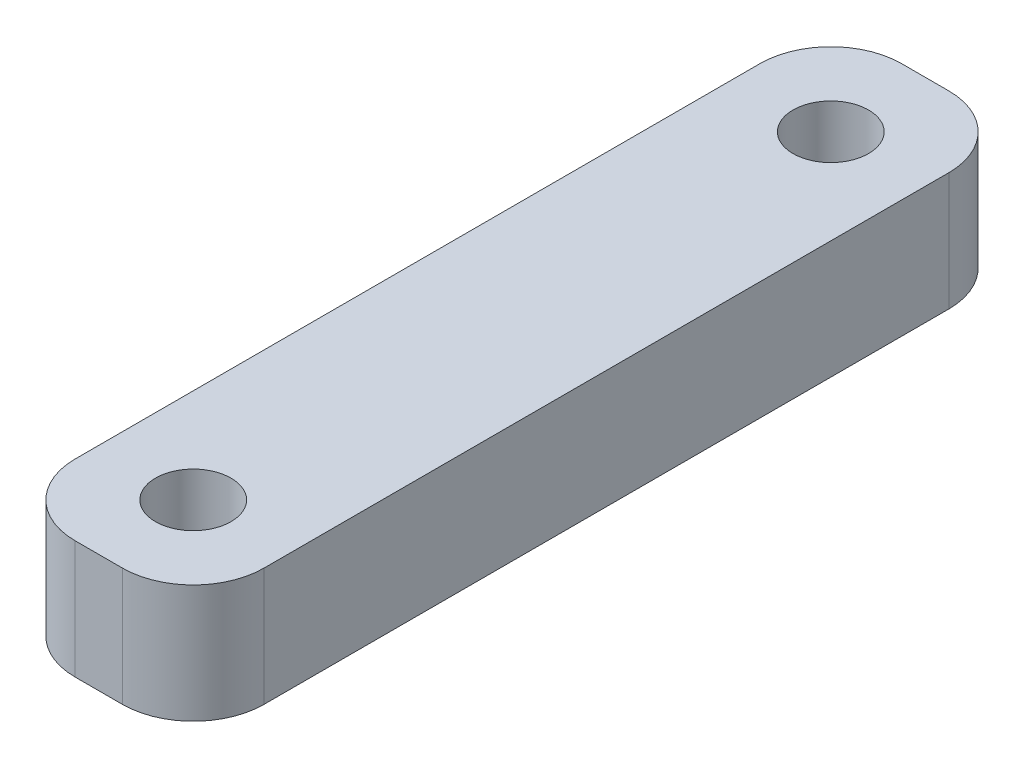
ISO-10303-21;
HEADER;
FILE_DESCRIPTION(('STEP AP214'),'2;1');
FILE_NAME('part.step','',(''),(''),'','','');
FILE_SCHEMA(('AUTOMOTIVE_DESIGN { 1 0 10303 214 1 1 1 1 }'));
ENDSEC;
DATA;
#1=APPLICATION_CONTEXT('core data for automotive mechanical design processes');
#2=APPLICATION_PROTOCOL_DEFINITION('international standard','automotive_design',2000,#1);
#3=PRODUCT_CONTEXT('',#1,'mechanical');
#4=PRODUCT('Part','Part','',(#3));
#5=PRODUCT_RELATED_PRODUCT_CATEGORY('part','',(#4));
#6=PRODUCT_DEFINITION_FORMATION('','',#4);
#7=PRODUCT_DEFINITION_CONTEXT('part definition',#1,'design');
#8=PRODUCT_DEFINITION('design','',#6,#7);
#9=PRODUCT_DEFINITION_SHAPE('','',#8);
#10=(LENGTH_UNIT() NAMED_UNIT(*) SI_UNIT(.MILLI.,.METRE.));
#11=(NAMED_UNIT(*) PLANE_ANGLE_UNIT() SI_UNIT($,.RADIAN.));
#12=(NAMED_UNIT(*) SI_UNIT($,.STERADIAN.) SOLID_ANGLE_UNIT());
#13=UNCERTAINTY_MEASURE_WITH_UNIT(LENGTH_MEASURE(1.E-05),#10,'distance_accuracy_value','');
#14=(GEOMETRIC_REPRESENTATION_CONTEXT(3) GLOBAL_UNCERTAINTY_ASSIGNED_CONTEXT((#13)) GLOBAL_UNIT_ASSIGNED_CONTEXT((#10,
#11,#12)) REPRESENTATION_CONTEXT('',''));
#15=CARTESIAN_POINT('',(0.,0.,0.));
#16=DIRECTION('',(0.,0.,1.));
#17=DIRECTION('',(1.,0.,0.));
#18=AXIS2_PLACEMENT_3D('',#15,#16,#17);
#19=CARTESIAN_POINT('',(0.,0.,35.));
#20=DIRECTION('',(1.,0.,0.));
#21=DIRECTION('',(0.,1.,0.));
#22=AXIS2_PLACEMENT_3D('',#19,#20,#21);
#23=PLANE('',#22);
#24=DIRECTION('',(0.,0.,-1.));
#25=VECTOR('',#24,1.);
#26=CARTESIAN_POINT('',(0.,0.,35.));
#27=LINE('',#26,#25);
#28=CARTESIAN_POINT('',(0.,0.,32.));
#29=VERTEX_POINT('',#28);
#30=CARTESIAN_POINT('',(0.,0.,3.));
#31=VERTEX_POINT('',#30);
#32=EDGE_CURVE('E154',#29,#31,#27,.T.);
#33=ORIENTED_EDGE('',*,*,#32,.T.);
#34=DIRECTION('',(0.,-1.,0.));
#35=VECTOR('',#34,1.);
#36=CARTESIAN_POINT('',(0.,0.,3.));
#37=LINE('',#36,#35);
#38=CARTESIAN_POINT('',(0.,-5.,3.));
#39=VERTEX_POINT('',#38);
#40=EDGE_CURVE('E118',#31,#39,#37,.T.);
#41=ORIENTED_EDGE('',*,*,#40,.T.);
#42=DIRECTION('',(0.,0.,-1.));
#43=VECTOR('',#42,1.);
#44=CARTESIAN_POINT('',(0.,-5.,35.));
#45=LINE('',#44,#43);
#46=CARTESIAN_POINT('',(0.,-5.,32.));
#47=VERTEX_POINT('',#46);
#48=EDGE_CURVE('E103',#47,#39,#45,.T.);
#49=ORIENTED_EDGE('',*,*,#48,.F.);
#50=DIRECTION('',(0.,-1.,0.));
#51=VECTOR('',#50,1.);
#52=CARTESIAN_POINT('',(0.,0.,32.));
#53=LINE('',#52,#51);
#54=EDGE_CURVE('E115',#47,#29,#53,.F.);
#55=ORIENTED_EDGE('',*,*,#54,.T.);
#56=EDGE_LOOP('',(#33,#41,#49,#55));
#57=FACE_BOUND('',#56,.T.);
#58=ADVANCED_FACE('F33',(#57),#23,.F.);
#59=CARTESIAN_POINT('',(0.,-5.,35.));
#60=DIRECTION('',(0.,1.,0.));
#61=DIRECTION('',(0.,0.,1.));
#62=AXIS2_PLACEMENT_3D('',#59,#60,#61);
#63=PLANE('',#62);
#64=CARTESIAN_POINT('',(4.,-5.,31.));
#65=DIRECTION('',(0.,1.,0.));
#66=DIRECTION('',(0.,0.,1.));
#67=AXIS2_PLACEMENT_3D('',#64,#65,#66);
#68=CIRCLE('',#67,1.59999999999997);
#69=CARTESIAN_POINT('',(4.,-5.,32.6));
#70=VERTEX_POINT('',#69);
#71=EDGE_CURVE('E290',#70,#70,#68,.T.);
#72=ORIENTED_EDGE('',*,*,#71,.T.);
#73=EDGE_LOOP('',(#72));
#74=FACE_BOUND('',#73,.T.);
#75=CARTESIAN_POINT('',(4.,-5.,4.));
#76=DIRECTION('',(0.,1.,0.));
#77=DIRECTION('',(0.,0.,1.));
#78=AXIS2_PLACEMENT_3D('',#75,#76,#77);
#79=CIRCLE('',#78,1.6);
#80=CARTESIAN_POINT('',(4.,-5.,5.6));
#81=VERTEX_POINT('',#80);
#82=EDGE_CURVE('E165',#81,#81,#79,.T.);
#83=ORIENTED_EDGE('',*,*,#82,.T.);
#84=EDGE_LOOP('',(#83));
#85=FACE_BOUND('',#84,.T.);
#86=ORIENTED_EDGE('',*,*,#48,.T.);
#87=CARTESIAN_POINT('',(3.,-5.,3.));
#88=DIRECTION('',(0.,1.,0.));
#89=DIRECTION('',(0.,0.,1.));
#90=AXIS2_PLACEMENT_3D('',#87,#88,#89);
#91=CIRCLE('',#90,3.);
#92=CARTESIAN_POINT('',(3.,-5.,0.));
#93=VERTEX_POINT('',#92);
#94=EDGE_CURVE('E130',#39,#93,#91,.F.);
#95=ORIENTED_EDGE('',*,*,#94,.T.);
#96=DIRECTION('',(1.,0.,0.));
#97=VECTOR('',#96,1.);
#98=CARTESIAN_POINT('',(0.,-5.,0.));
#99=LINE('',#98,#97);
#100=CARTESIAN_POINT('',(5.,-5.,0.));
#101=VERTEX_POINT('',#100);
#102=EDGE_CURVE('E162',#93,#101,#99,.T.);
#103=ORIENTED_EDGE('',*,*,#102,.T.);
#104=CARTESIAN_POINT('',(5.,-5.,3.));
#105=DIRECTION('',(0.,1.,0.));
#106=DIRECTION('',(0.,0.,1.));
#107=AXIS2_PLACEMENT_3D('',#104,#105,#106);
#108=CIRCLE('',#107,3.);
#109=CARTESIAN_POINT('',(8.,-5.,3.));
#110=VERTEX_POINT('',#109);
#111=EDGE_CURVE('E109',#101,#110,#108,.F.);
#112=ORIENTED_EDGE('',*,*,#111,.T.);
#113=DIRECTION('',(0.,0.,-1.));
#114=VECTOR('',#113,1.);
#115=CARTESIAN_POINT('',(8.,-5.,35.));
#116=LINE('',#115,#114);
#117=CARTESIAN_POINT('',(8.,-5.,32.));
#118=VERTEX_POINT('',#117);
#119=EDGE_CURVE('E119',#118,#110,#116,.T.);
#120=ORIENTED_EDGE('',*,*,#119,.F.);
#121=CARTESIAN_POINT('',(5.,-5.,32.));
#122=DIRECTION('',(0.,1.,0.));
#123=DIRECTION('',(0.,0.,1.));
#124=AXIS2_PLACEMENT_3D('',#121,#122,#123);
#125=CIRCLE('',#124,3.);
#126=CARTESIAN_POINT('',(5.,-5.,35.));
#127=VERTEX_POINT('',#126);
#128=EDGE_CURVE('E110',#118,#127,#125,.F.);
#129=ORIENTED_EDGE('',*,*,#128,.T.);
#130=DIRECTION('',(1.,0.,0.));
#131=VECTOR('',#130,1.);
#132=CARTESIAN_POINT('',(0.,-5.,35.));
#133=LINE('',#132,#131);
#134=CARTESIAN_POINT('',(3.,-5.,35.));
#135=VERTEX_POINT('',#134);
#136=EDGE_CURVE('E105',#135,#127,#133,.T.);
#137=ORIENTED_EDGE('',*,*,#136,.F.);
#138=CARTESIAN_POINT('',(3.,-5.,32.));
#139=DIRECTION('',(0.,1.,0.));
#140=DIRECTION('',(0.,0.,1.));
#141=AXIS2_PLACEMENT_3D('',#138,#139,#140);
#142=CIRCLE('',#141,3.);
#143=EDGE_CURVE('E100',#135,#47,#142,.F.);
#144=ORIENTED_EDGE('',*,*,#143,.T.);
#145=EDGE_LOOP('',(#86,#95,#103,#112,#120,#129,#137,#144));
#146=FACE_BOUND('',#145,.T.);
#147=ADVANCED_FACE('F102',(#74,#85,#146),#63,.F.);
#148=CARTESIAN_POINT('',(8.,0.,35.));
#149=DIRECTION('',(-1.,0.,0.));
#150=DIRECTION('',(0.,-1.,0.));
#151=AXIS2_PLACEMENT_3D('',#148,#149,#150);
#152=PLANE('',#151);
#153=ORIENTED_EDGE('',*,*,#119,.T.);
#154=DIRECTION('',(0.,1.,0.));
#155=VECTOR('',#154,1.);
#156=CARTESIAN_POINT('',(8.,0.,3.));
#157=LINE('',#156,#155);
#158=CARTESIAN_POINT('',(8.,0.,3.));
#159=VERTEX_POINT('',#158);
#160=EDGE_CURVE('E143',#110,#159,#157,.T.);
#161=ORIENTED_EDGE('',*,*,#160,.T.);
#162=DIRECTION('',(0.,0.,-1.));
#163=VECTOR('',#162,1.);
#164=CARTESIAN_POINT('',(8.,0.,35.));
#165=LINE('',#164,#163);
#166=CARTESIAN_POINT('',(8.,0.,32.));
#167=VERTEX_POINT('',#166);
#168=EDGE_CURVE('E156',#167,#159,#165,.T.);
#169=ORIENTED_EDGE('',*,*,#168,.F.);
#170=DIRECTION('',(0.,1.,0.));
#171=VECTOR('',#170,1.);
#172=CARTESIAN_POINT('',(8.,-5.,32.));
#173=LINE('',#172,#171);
#174=EDGE_CURVE('E141',#167,#118,#173,.F.);
#175=ORIENTED_EDGE('',*,*,#174,.T.);
#176=EDGE_LOOP('',(#153,#161,#169,#175));
#177=FACE_BOUND('',#176,.T.);
#178=ADVANCED_FACE('F170',(#177),#152,.F.);
#179=CARTESIAN_POINT('',(0.,0.,35.));
#180=DIRECTION('',(0.,-1.,0.));
#181=DIRECTION('',(0.,0.,-1.));
#182=AXIS2_PLACEMENT_3D('',#179,#180,#181);
#183=PLANE('',#182);
#184=CARTESIAN_POINT('',(4.,0.,31.));
#185=DIRECTION('',(0.,1.,0.));
#186=DIRECTION('',(0.,0.,1.));
#187=AXIS2_PLACEMENT_3D('',#184,#185,#186);
#188=CIRCLE('',#187,1.59999999999997);
#189=CARTESIAN_POINT('',(4.,0.,32.6));
#190=VERTEX_POINT('',#189);
#191=EDGE_CURVE('E285',#190,#190,#188,.T.);
#192=ORIENTED_EDGE('',*,*,#191,.F.);
#193=EDGE_LOOP('',(#192));
#194=FACE_BOUND('',#193,.T.);
#195=CARTESIAN_POINT('',(4.,0.,4.));
#196=DIRECTION('',(0.,1.,0.));
#197=DIRECTION('',(0.,0.,1.));
#198=AXIS2_PLACEMENT_3D('',#195,#196,#197);
#199=CIRCLE('',#198,1.6);
#200=CARTESIAN_POINT('',(4.,0.,5.6));
#201=VERTEX_POINT('',#200);
#202=EDGE_CURVE('E288',#201,#201,#199,.T.);
#203=ORIENTED_EDGE('',*,*,#202,.F.);
#204=EDGE_LOOP('',(#203));
#205=FACE_BOUND('',#204,.T.);
#206=DIRECTION('',(-1.,0.,0.));
#207=VECTOR('',#206,1.);
#208=CARTESIAN_POINT('',(0.,0.,0.));
#209=LINE('',#208,#207);
#210=CARTESIAN_POINT('',(5.,0.,0.));
#211=VERTEX_POINT('',#210);
#212=CARTESIAN_POINT('',(3.,0.,0.));
#213=VERTEX_POINT('',#212);
#214=EDGE_CURVE('E158',#211,#213,#209,.T.);
#215=ORIENTED_EDGE('',*,*,#214,.T.);
#216=CARTESIAN_POINT('',(3.,0.,3.));
#217=DIRECTION('',(0.,-1.,0.));
#218=DIRECTION('',(0.,0.,-1.));
#219=AXIS2_PLACEMENT_3D('',#216,#217,#218);
#220=CIRCLE('',#219,3.);
#221=EDGE_CURVE('E139',#213,#31,#220,.F.);
#222=ORIENTED_EDGE('',*,*,#221,.T.);
#223=ORIENTED_EDGE('',*,*,#32,.F.);
#224=CARTESIAN_POINT('',(3.,0.,32.));
#225=DIRECTION('',(0.,-1.,0.));
#226=DIRECTION('',(0.,0.,-1.));
#227=AXIS2_PLACEMENT_3D('',#224,#225,#226);
#228=CIRCLE('',#227,3.);
#229=CARTESIAN_POINT('',(3.,0.,35.));
#230=VERTEX_POINT('',#229);
#231=EDGE_CURVE('E123',#29,#230,#228,.F.);
#232=ORIENTED_EDGE('',*,*,#231,.T.);
#233=DIRECTION('',(-1.,0.,0.));
#234=VECTOR('',#233,1.);
#235=CARTESIAN_POINT('',(0.,0.,35.));
#236=LINE('',#235,#234);
#237=CARTESIAN_POINT('',(5.,0.,35.));
#238=VERTEX_POINT('',#237);
#239=EDGE_CURVE('E149',#238,#230,#236,.T.);
#240=ORIENTED_EDGE('',*,*,#239,.F.);
#241=CARTESIAN_POINT('',(5.,0.,32.));
#242=DIRECTION('',(0.,-1.,0.));
#243=DIRECTION('',(0.,0.,-1.));
#244=AXIS2_PLACEMENT_3D('',#241,#242,#243);
#245=CIRCLE('',#244,3.);
#246=EDGE_CURVE('E56',#238,#167,#245,.F.);
#247=ORIENTED_EDGE('',*,*,#246,.T.);
#248=ORIENTED_EDGE('',*,*,#168,.T.);
#249=CARTESIAN_POINT('',(5.,0.,3.));
#250=DIRECTION('',(0.,-1.,0.));
#251=DIRECTION('',(0.,0.,-1.));
#252=AXIS2_PLACEMENT_3D('',#249,#250,#251);
#253=CIRCLE('',#252,3.);
#254=EDGE_CURVE('E48',#159,#211,#253,.F.);
#255=ORIENTED_EDGE('',*,*,#254,.T.);
#256=EDGE_LOOP('',(#215,#222,#223,#232,#240,#247,#248,#255));
#257=FACE_BOUND('',#256,.T.);
#258=ADVANCED_FACE('F153',(#194,#205,#257),#183,.F.);
#259=CARTESIAN_POINT('',(0.,0.,35.));
#260=DIRECTION('',(0.,0.,1.));
#261=DIRECTION('',(1.,0.,0.));
#262=AXIS2_PLACEMENT_3D('',#259,#260,#261);
#263=PLANE('',#262);
#264=ORIENTED_EDGE('',*,*,#239,.T.);
#265=DIRECTION('',(0.,-1.,0.));
#266=VECTOR('',#265,1.);
#267=CARTESIAN_POINT('',(3.,-5.,35.));
#268=LINE('',#267,#266);
#269=EDGE_CURVE('E11',#230,#135,#268,.T.);
#270=ORIENTED_EDGE('',*,*,#269,.T.);
#271=ORIENTED_EDGE('',*,*,#136,.T.);
#272=DIRECTION('',(0.,1.,0.));
#273=VECTOR('',#272,1.);
#274=CARTESIAN_POINT('',(5.,0.,35.));
#275=LINE('',#274,#273);
#276=EDGE_CURVE('E41',#127,#238,#275,.T.);
#277=ORIENTED_EDGE('',*,*,#276,.T.);
#278=EDGE_LOOP('',(#264,#270,#271,#277));
#279=FACE_BOUND('',#278,.T.);
#280=ADVANCED_FACE('F148',(#279),#263,.T.);
#281=CARTESIAN_POINT('',(0.,0.,0.));
#282=DIRECTION('',(0.,0.,1.));
#283=DIRECTION('',(1.,0.,0.));
#284=AXIS2_PLACEMENT_3D('',#281,#282,#283);
#285=PLANE('',#284);
#286=ORIENTED_EDGE('',*,*,#102,.F.);
#287=DIRECTION('',(0.,-1.,0.));
#288=VECTOR('',#287,1.);
#289=CARTESIAN_POINT('',(3.,0.,0.));
#290=LINE('',#289,#288);
#291=EDGE_CURVE('E134',#93,#213,#290,.F.);
#292=ORIENTED_EDGE('',*,*,#291,.T.);
#293=ORIENTED_EDGE('',*,*,#214,.F.);
#294=DIRECTION('',(0.,1.,0.));
#295=VECTOR('',#294,1.);
#296=CARTESIAN_POINT('',(5.,0.,0.));
#297=LINE('',#296,#295);
#298=EDGE_CURVE('E132',#211,#101,#297,.F.);
#299=ORIENTED_EDGE('',*,*,#298,.T.);
#300=EDGE_LOOP('',(#286,#292,#293,#299));
#301=FACE_BOUND('',#300,.T.);
#302=ADVANCED_FACE('F177',(#301),#285,.F.);
#303=CARTESIAN_POINT('',(4.,-5.,4.));
#304=DIRECTION('',(0.,1.,0.));
#305=DIRECTION('',(0.,0.,1.));
#306=AXIS2_PLACEMENT_3D('',#303,#304,#305);
#307=CYLINDRICAL_SURFACE('',#306,1.6);
#308=ORIENTED_EDGE('',*,*,#82,.F.);
#309=EDGE_LOOP('',(#308));
#310=FACE_BOUND('',#309,.T.);
#311=ORIENTED_EDGE('',*,*,#202,.T.);
#312=EDGE_LOOP('',(#311));
#313=FACE_BOUND('',#312,.T.);
#314=ADVANCED_FACE('F228',(#310,#313),#307,.F.);
#315=CARTESIAN_POINT('',(4.,-5.,31.));
#316=DIRECTION('',(0.,1.,0.));
#317=DIRECTION('',(0.,0.,1.));
#318=AXIS2_PLACEMENT_3D('',#315,#316,#317);
#319=CYLINDRICAL_SURFACE('',#318,1.59999999999997);
#320=ORIENTED_EDGE('',*,*,#71,.F.);
#321=EDGE_LOOP('',(#320));
#322=FACE_BOUND('',#321,.T.);
#323=ORIENTED_EDGE('',*,*,#191,.T.);
#324=EDGE_LOOP('',(#323));
#325=FACE_BOUND('',#324,.T.);
#326=ADVANCED_FACE('F197',(#322,#325),#319,.F.);
#327=CARTESIAN_POINT('',(3.,0.,3.));
#328=DIRECTION('',(0.,-1.,0.));
#329=DIRECTION('',(1.,0.,0.));
#330=AXIS2_PLACEMENT_3D('',#327,#328,#329);
#331=CYLINDRICAL_SURFACE('',#330,3.);
#332=ORIENTED_EDGE('',*,*,#221,.F.);
#333=ORIENTED_EDGE('',*,*,#291,.F.);
#334=ORIENTED_EDGE('',*,*,#94,.F.);
#335=ORIENTED_EDGE('',*,*,#40,.F.);
#336=EDGE_LOOP('',(#332,#333,#334,#335));
#337=FACE_BOUND('',#336,.T.);
#338=ADVANCED_FACE('F181',(#337),#331,.T.);
#339=CARTESIAN_POINT('',(5.,0.,3.));
#340=DIRECTION('',(0.,1.,0.));
#341=DIRECTION('',(-1.,0.,0.));
#342=AXIS2_PLACEMENT_3D('',#339,#340,#341);
#343=CYLINDRICAL_SURFACE('',#342,3.);
#344=ORIENTED_EDGE('',*,*,#111,.F.);
#345=ORIENTED_EDGE('',*,*,#298,.F.);
#346=ORIENTED_EDGE('',*,*,#254,.F.);
#347=ORIENTED_EDGE('',*,*,#160,.F.);
#348=EDGE_LOOP('',(#344,#345,#346,#347));
#349=FACE_BOUND('',#348,.T.);
#350=ADVANCED_FACE('F173',(#349),#343,.T.);
#351=CARTESIAN_POINT('',(3.,0.,32.));
#352=DIRECTION('',(0.,1.,0.));
#353=DIRECTION('',(-1.,0.,0.));
#354=AXIS2_PLACEMENT_3D('',#351,#352,#353);
#355=CYLINDRICAL_SURFACE('',#354,3.);
#356=ORIENTED_EDGE('',*,*,#231,.F.);
#357=ORIENTED_EDGE('',*,*,#54,.F.);
#358=ORIENTED_EDGE('',*,*,#143,.F.);
#359=ORIENTED_EDGE('',*,*,#269,.F.);
#360=EDGE_LOOP('',(#356,#357,#358,#359));
#361=FACE_BOUND('',#360,.T.);
#362=ADVANCED_FACE('F122',(#361),#355,.T.);
#363=CARTESIAN_POINT('',(5.,0.,32.));
#364=DIRECTION('',(0.,-1.,0.));
#365=DIRECTION('',(1.,0.,0.));
#366=AXIS2_PLACEMENT_3D('',#363,#364,#365);
#367=CYLINDRICAL_SURFACE('',#366,3.);
#368=ORIENTED_EDGE('',*,*,#128,.F.);
#369=ORIENTED_EDGE('',*,*,#174,.F.);
#370=ORIENTED_EDGE('',*,*,#246,.F.);
#371=ORIENTED_EDGE('',*,*,#276,.F.);
#372=EDGE_LOOP('',(#368,#369,#370,#371));
#373=FACE_BOUND('',#372,.T.);
#374=ADVANCED_FACE('F35',(#373),#367,.T.);
#375=CLOSED_SHELL('',(#58,#147,#178,#258,#280,#302,#314,#326,#338,#350,#362,#374));
#376=MANIFOLD_SOLID_BREP('B2',#375);
#377=ADVANCED_BREP_SHAPE_REPRESENTATION('',(#18,#376),#14);
#378=SHAPE_DEFINITION_REPRESENTATION(#9,#377);
ENDSEC;
END-ISO-10303-21;
